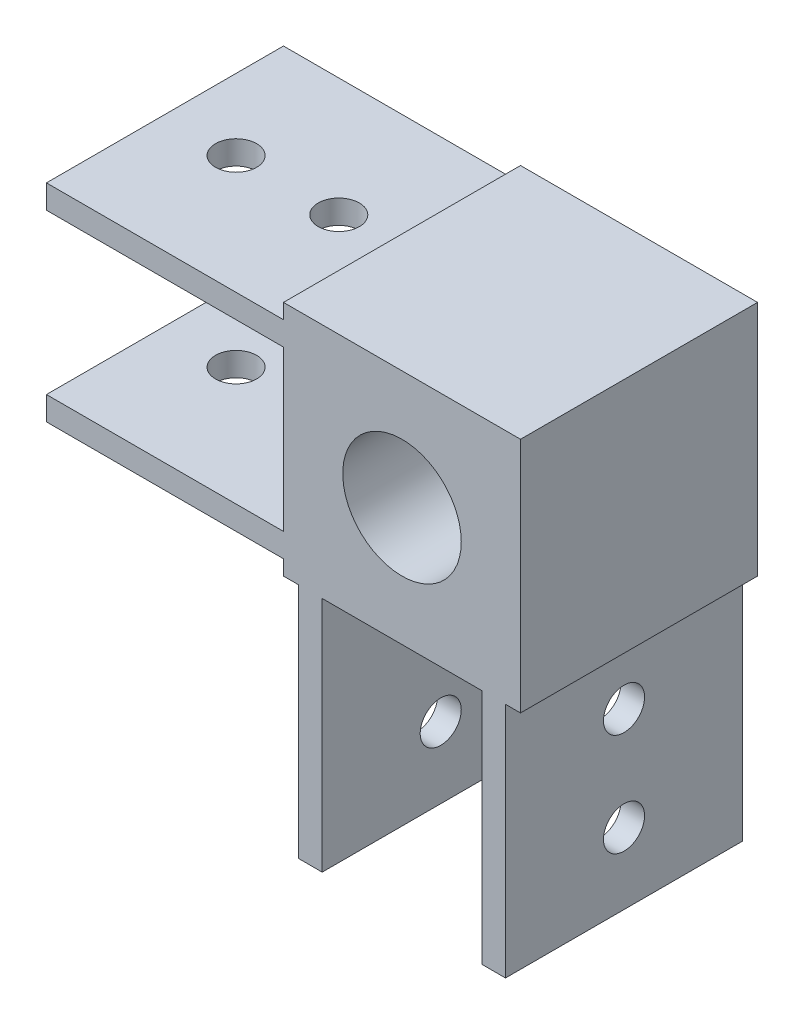
ISO-10303-21;
HEADER;
FILE_DESCRIPTION(('STEP AP214'),'2;1');
FILE_NAME('part.step','',(''),(''),'','','');
FILE_SCHEMA(('AUTOMOTIVE_DESIGN { 1 0 10303 214 1 1 1 1 }'));
ENDSEC;
DATA;
#1=APPLICATION_CONTEXT('core data for automotive mechanical design processes');
#2=APPLICATION_PROTOCOL_DEFINITION('international standard','automotive_design',2000,#1);
#3=PRODUCT_CONTEXT('',#1,'mechanical');
#4=PRODUCT('Part','Part','',(#3));
#5=PRODUCT_RELATED_PRODUCT_CATEGORY('part','',(#4));
#6=PRODUCT_DEFINITION_FORMATION('','',#4);
#7=PRODUCT_DEFINITION_CONTEXT('part definition',#1,'design');
#8=PRODUCT_DEFINITION('design','',#6,#7);
#9=PRODUCT_DEFINITION_SHAPE('','',#8);
#10=(LENGTH_UNIT() NAMED_UNIT(*) SI_UNIT(.MILLI.,.METRE.));
#11=(NAMED_UNIT(*) PLANE_ANGLE_UNIT() SI_UNIT($,.RADIAN.));
#12=(NAMED_UNIT(*) SI_UNIT($,.STERADIAN.) SOLID_ANGLE_UNIT());
#13=UNCERTAINTY_MEASURE_WITH_UNIT(LENGTH_MEASURE(1.E-05),#10,'distance_accuracy_value','');
#14=(GEOMETRIC_REPRESENTATION_CONTEXT(3) GLOBAL_UNCERTAINTY_ASSIGNED_CONTEXT((#13)) GLOBAL_UNIT_ASSIGNED_CONTEXT((#10,
#11,#12)) REPRESENTATION_CONTEXT('',''));
#15=CARTESIAN_POINT('',(0.,0.,0.));
#16=DIRECTION('',(0.,0.,1.));
#17=DIRECTION('',(1.,0.,0.));
#18=AXIS2_PLACEMENT_3D('',#15,#16,#17);
#19=CARTESIAN_POINT('',(15.,-15.,30.));
#20=DIRECTION('',(-1.,0.,0.));
#21=DIRECTION('',(0.,-1.,0.));
#22=AXIS2_PLACEMENT_3D('',#19,#20,#21);
#23=PLANE('',#22);
#24=DIRECTION('',(0.,1.,0.));
#25=VECTOR('',#24,1.);
#26=CARTESIAN_POINT('',(15.,-15.,0.));
#27=LINE('',#26,#25);
#28=CARTESIAN_POINT('',(15.,-15.,0.));
#29=VERTEX_POINT('',#28);
#30=CARTESIAN_POINT('',(15.,15.,0.));
#31=VERTEX_POINT('',#30);
#32=EDGE_CURVE('E209',#29,#31,#27,.T.);
#33=ORIENTED_EDGE('',*,*,#32,.T.);
#34=DIRECTION('',(0.,0.,-1.));
#35=VECTOR('',#34,1.);
#36=CARTESIAN_POINT('',(15.,15.,30.));
#37=LINE('',#36,#35);
#38=CARTESIAN_POINT('',(15.,15.,30.));
#39=VERTEX_POINT('',#38);
#40=EDGE_CURVE('E11',#39,#31,#37,.T.);
#41=ORIENTED_EDGE('',*,*,#40,.F.);
#42=DIRECTION('',(0.,1.,0.));
#43=VECTOR('',#42,1.);
#44=CARTESIAN_POINT('',(15.,-15.,30.));
#45=LINE('',#44,#43);
#46=CARTESIAN_POINT('',(15.,-15.,30.));
#47=VERTEX_POINT('',#46);
#48=EDGE_CURVE('E248',#47,#39,#45,.T.);
#49=ORIENTED_EDGE('',*,*,#48,.F.);
#50=DIRECTION('',(0.,0.,-1.));
#51=VECTOR('',#50,1.);
#52=CARTESIAN_POINT('',(15.,-15.,30.));
#53=LINE('',#52,#51);
#54=EDGE_CURVE('E205',#47,#29,#53,.T.);
#55=ORIENTED_EDGE('',*,*,#54,.T.);
#56=EDGE_LOOP('',(#33,#41,#49,#55));
#57=FACE_BOUND('',#56,.T.);
#58=ADVANCED_FACE('F39',(#57),#23,.F.);
#59=CARTESIAN_POINT('',(-15.,15.,30.));
#60=DIRECTION('',(0.,-1.,0.));
#61=DIRECTION('',(1.,0.,0.));
#62=AXIS2_PLACEMENT_3D('',#59,#60,#61);
#63=PLANE('',#62);
#64=DIRECTION('',(-1.,0.,0.));
#65=VECTOR('',#64,1.);
#66=CARTESIAN_POINT('',(-15.,15.,0.));
#67=LINE('',#66,#65);
#68=CARTESIAN_POINT('',(-15.,15.,0.));
#69=VERTEX_POINT('',#68);
#70=EDGE_CURVE('E212',#31,#69,#67,.T.);
#71=ORIENTED_EDGE('',*,*,#70,.T.);
#72=DIRECTION('',(0.,0.,-1.));
#73=VECTOR('',#72,1.);
#74=CARTESIAN_POINT('',(-15.,15.,30.));
#75=LINE('',#74,#73);
#76=CARTESIAN_POINT('',(-15.,15.,30.));
#77=VERTEX_POINT('',#76);
#78=EDGE_CURVE('E48',#77,#69,#75,.T.);
#79=ORIENTED_EDGE('',*,*,#78,.F.);
#80=DIRECTION('',(-1.,0.,0.));
#81=VECTOR('',#80,1.);
#82=CARTESIAN_POINT('',(-15.,15.,30.));
#83=LINE('',#82,#81);
#84=EDGE_CURVE('E136',#39,#77,#83,.T.);
#85=ORIENTED_EDGE('',*,*,#84,.F.);
#86=ORIENTED_EDGE('',*,*,#40,.T.);
#87=EDGE_LOOP('',(#71,#79,#85,#86));
#88=FACE_BOUND('',#87,.T.);
#89=ADVANCED_FACE('F408',(#88),#63,.F.);
#90=CARTESIAN_POINT('',(-15.,13.1,30.));
#91=DIRECTION('',(1.,0.,0.));
#92=DIRECTION('',(0.,1.,0.));
#93=AXIS2_PLACEMENT_3D('',#90,#91,#92);
#94=PLANE('',#93);
#95=DIRECTION('',(0.,-1.,0.));
#96=VECTOR('',#95,1.);
#97=CARTESIAN_POINT('',(-15.,13.1,0.));
#98=LINE('',#97,#96);
#99=CARTESIAN_POINT('',(-15.,13.1,0.));
#100=VERTEX_POINT('',#99);
#101=EDGE_CURVE('E215',#69,#100,#98,.T.);
#102=ORIENTED_EDGE('',*,*,#101,.T.);
#103=DIRECTION('',(0.,0.,-1.));
#104=VECTOR('',#103,1.);
#105=CARTESIAN_POINT('',(-15.,13.1,30.));
#106=LINE('',#105,#104);
#107=CARTESIAN_POINT('',(-15.,13.1,30.));
#108=VERTEX_POINT('',#107);
#109=EDGE_CURVE('E291',#108,#100,#106,.T.);
#110=ORIENTED_EDGE('',*,*,#109,.F.);
#111=DIRECTION('',(0.,-1.,0.));
#112=VECTOR('',#111,1.);
#113=CARTESIAN_POINT('',(-15.,13.1,30.));
#114=LINE('',#113,#112);
#115=EDGE_CURVE('E351',#77,#108,#114,.T.);
#116=ORIENTED_EDGE('',*,*,#115,.F.);
#117=ORIENTED_EDGE('',*,*,#78,.T.);
#118=EDGE_LOOP('',(#102,#110,#116,#117));
#119=FACE_BOUND('',#118,.T.);
#120=ADVANCED_FACE('F412',(#119),#94,.F.);
#121=CARTESIAN_POINT('',(-15.,13.1,30.));
#122=DIRECTION('',(0.,-1.,0.));
#123=DIRECTION('',(1.,0.,0.));
#124=AXIS2_PLACEMENT_3D('',#121,#122,#123);
#125=PLANE('',#124);
#126=CARTESIAN_POINT('',(-23.,13.1,15.));
#127=DIRECTION('',(0.,1.,0.));
#128=DIRECTION('',(-1.,0.,0.));
#129=AXIS2_PLACEMENT_3D('',#126,#127,#128);
#130=CIRCLE('',#129,2.6);
#131=CARTESIAN_POINT('',(-25.6,13.1,15.));
#132=VERTEX_POINT('',#131);
#133=EDGE_CURVE('E298',#132,#132,#130,.T.);
#134=ORIENTED_EDGE('',*,*,#133,.F.);
#135=EDGE_LOOP('',(#134));
#136=FACE_BOUND('',#135,.T.);
#137=CARTESIAN_POINT('',(-36.,13.1,15.));
#138=DIRECTION('',(0.,1.,0.));
#139=DIRECTION('',(-1.,0.,0.));
#140=AXIS2_PLACEMENT_3D('',#137,#138,#139);
#141=CIRCLE('',#140,2.6);
#142=CARTESIAN_POINT('',(-38.6,13.1,15.));
#143=VERTEX_POINT('',#142);
#144=EDGE_CURVE('E305',#143,#143,#141,.T.);
#145=ORIENTED_EDGE('',*,*,#144,.F.);
#146=EDGE_LOOP('',(#145));
#147=FACE_BOUND('',#146,.T.);
#148=DIRECTION('',(-1.,0.,0.));
#149=VECTOR('',#148,1.);
#150=CARTESIAN_POINT('',(-15.,13.1,0.));
#151=LINE('',#150,#149);
#152=CARTESIAN_POINT('',(-45.,13.1,0.));
#153=VERTEX_POINT('',#152);
#154=EDGE_CURVE('E217',#100,#153,#151,.T.);
#155=ORIENTED_EDGE('',*,*,#154,.T.);
#156=DIRECTION('',(0.,0.,-1.));
#157=VECTOR('',#156,1.);
#158=CARTESIAN_POINT('',(-45.,13.1,30.));
#159=LINE('',#158,#157);
#160=CARTESIAN_POINT('',(-45.,13.1,30.));
#161=VERTEX_POINT('',#160);
#162=EDGE_CURVE('E288',#161,#153,#159,.T.);
#163=ORIENTED_EDGE('',*,*,#162,.F.);
#164=DIRECTION('',(-1.,0.,0.));
#165=VECTOR('',#164,1.);
#166=CARTESIAN_POINT('',(-15.,13.1,30.));
#167=LINE('',#166,#165);
#168=EDGE_CURVE('E353',#108,#161,#167,.T.);
#169=ORIENTED_EDGE('',*,*,#168,.F.);
#170=ORIENTED_EDGE('',*,*,#109,.T.);
#171=EDGE_LOOP('',(#155,#163,#169,#170));
#172=FACE_BOUND('',#171,.T.);
#173=ADVANCED_FACE('F416',(#136,#147,#172),#125,.F.);
#174=CARTESIAN_POINT('',(-45.,13.1,30.));
#175=DIRECTION('',(1.,0.,0.));
#176=DIRECTION('',(0.,0.,-1.));
#177=AXIS2_PLACEMENT_3D('',#174,#175,#176);
#178=PLANE('',#177);
#179=DIRECTION('',(0.,-1.,0.));
#180=VECTOR('',#179,1.);
#181=CARTESIAN_POINT('',(-45.,13.1,0.));
#182=LINE('',#181,#180);
#183=CARTESIAN_POINT('',(-45.,10.1,0.));
#184=VERTEX_POINT('',#183);
#185=EDGE_CURVE('E219',#153,#184,#182,.T.);
#186=ORIENTED_EDGE('',*,*,#185,.T.);
#187=DIRECTION('',(0.,0.,-1.));
#188=VECTOR('',#187,1.);
#189=CARTESIAN_POINT('',(-45.,10.1,30.));
#190=LINE('',#189,#188);
#191=CARTESIAN_POINT('',(-45.,10.1,30.));
#192=VERTEX_POINT('',#191);
#193=EDGE_CURVE('E285',#192,#184,#190,.T.);
#194=ORIENTED_EDGE('',*,*,#193,.F.);
#195=DIRECTION('',(0.,-1.,0.));
#196=VECTOR('',#195,1.);
#197=CARTESIAN_POINT('',(-45.,13.1,30.));
#198=LINE('',#197,#196);
#199=EDGE_CURVE('E355',#161,#192,#198,.T.);
#200=ORIENTED_EDGE('',*,*,#199,.F.);
#201=ORIENTED_EDGE('',*,*,#162,.T.);
#202=EDGE_LOOP('',(#186,#194,#200,#201));
#203=FACE_BOUND('',#202,.T.);
#204=ADVANCED_FACE('F422',(#203),#178,.F.);
#205=CARTESIAN_POINT('',(-15.,10.1,30.));
#206=DIRECTION('',(0.,1.,0.));
#207=DIRECTION('',(-1.,0.,0.));
#208=AXIS2_PLACEMENT_3D('',#205,#206,#207);
#209=PLANE('',#208);
#210=CARTESIAN_POINT('',(-23.,10.1,15.));
#211=DIRECTION('',(0.,1.,0.));
#212=DIRECTION('',(-1.,0.,0.));
#213=AXIS2_PLACEMENT_3D('',#210,#211,#212);
#214=CIRCLE('',#213,2.6);
#215=CARTESIAN_POINT('',(-25.6,10.1,15.));
#216=VERTEX_POINT('',#215);
#217=EDGE_CURVE('E317',#216,#216,#214,.T.);
#218=ORIENTED_EDGE('',*,*,#217,.T.);
#219=EDGE_LOOP('',(#218));
#220=FACE_BOUND('',#219,.T.);
#221=CARTESIAN_POINT('',(-36.,10.1,15.));
#222=DIRECTION('',(0.,1.,0.));
#223=DIRECTION('',(-1.,0.,0.));
#224=AXIS2_PLACEMENT_3D('',#221,#222,#223);
#225=CIRCLE('',#224,2.6);
#226=CARTESIAN_POINT('',(-38.6,10.1,15.));
#227=VERTEX_POINT('',#226);
#228=EDGE_CURVE('E302',#227,#227,#225,.T.);
#229=ORIENTED_EDGE('',*,*,#228,.T.);
#230=EDGE_LOOP('',(#229));
#231=FACE_BOUND('',#230,.T.);
#232=DIRECTION('',(1.,0.,0.));
#233=VECTOR('',#232,1.);
#234=CARTESIAN_POINT('',(-15.,10.1,0.));
#235=LINE('',#234,#233);
#236=CARTESIAN_POINT('',(-15.,10.1,0.));
#237=VERTEX_POINT('',#236);
#238=EDGE_CURVE('E221',#184,#237,#235,.T.);
#239=ORIENTED_EDGE('',*,*,#238,.T.);
#240=DIRECTION('',(0.,0.,-1.));
#241=VECTOR('',#240,1.);
#242=CARTESIAN_POINT('',(-15.,10.1,30.));
#243=LINE('',#242,#241);
#244=CARTESIAN_POINT('',(-15.,10.1,30.));
#245=VERTEX_POINT('',#244);
#246=EDGE_CURVE('E282',#245,#237,#243,.T.);
#247=ORIENTED_EDGE('',*,*,#246,.F.);
#248=DIRECTION('',(1.,0.,0.));
#249=VECTOR('',#248,1.);
#250=CARTESIAN_POINT('',(-15.,10.1,30.));
#251=LINE('',#250,#249);
#252=EDGE_CURVE('E357',#192,#245,#251,.T.);
#253=ORIENTED_EDGE('',*,*,#252,.F.);
#254=ORIENTED_EDGE('',*,*,#193,.T.);
#255=EDGE_LOOP('',(#239,#247,#253,#254));
#256=FACE_BOUND('',#255,.T.);
#257=ADVANCED_FACE('F426',(#220,#231,#256),#209,.F.);
#258=CARTESIAN_POINT('',(-15.,-10.1,30.));
#259=DIRECTION('',(1.,0.,0.));
#260=DIRECTION('',(0.,1.,0.));
#261=AXIS2_PLACEMENT_3D('',#258,#259,#260);
#262=PLANE('',#261);
#263=DIRECTION('',(0.,-1.,0.));
#264=VECTOR('',#263,1.);
#265=CARTESIAN_POINT('',(-15.,-10.1,0.));
#266=LINE('',#265,#264);
#267=CARTESIAN_POINT('',(-15.,-10.1,0.));
#268=VERTEX_POINT('',#267);
#269=EDGE_CURVE('E223',#237,#268,#266,.T.);
#270=ORIENTED_EDGE('',*,*,#269,.T.);
#271=DIRECTION('',(0.,0.,-1.));
#272=VECTOR('',#271,1.);
#273=CARTESIAN_POINT('',(-15.,-10.1,30.));
#274=LINE('',#273,#272);
#275=CARTESIAN_POINT('',(-15.,-10.1,30.));
#276=VERTEX_POINT('',#275);
#277=EDGE_CURVE('E279',#276,#268,#274,.T.);
#278=ORIENTED_EDGE('',*,*,#277,.F.);
#279=DIRECTION('',(0.,-1.,0.));
#280=VECTOR('',#279,1.);
#281=CARTESIAN_POINT('',(-15.,-10.1,30.));
#282=LINE('',#281,#280);
#283=EDGE_CURVE('E359',#245,#276,#282,.T.);
#284=ORIENTED_EDGE('',*,*,#283,.F.);
#285=ORIENTED_EDGE('',*,*,#246,.T.);
#286=EDGE_LOOP('',(#270,#278,#284,#285));
#287=FACE_BOUND('',#286,.T.);
#288=ADVANCED_FACE('F430',(#287),#262,.F.);
#289=CARTESIAN_POINT('',(-15.,-10.1,30.));
#290=DIRECTION('',(0.,-1.,0.));
#291=DIRECTION('',(1.,0.,0.));
#292=AXIS2_PLACEMENT_3D('',#289,#290,#291);
#293=PLANE('',#292);
#294=CARTESIAN_POINT('',(-23.,-10.1,15.));
#295=DIRECTION('',(0.,-1.,0.));
#296=DIRECTION('',(1.,0.,0.));
#297=AXIS2_PLACEMENT_3D('',#294,#295,#296);
#298=CIRCLE('',#297,2.6);
#299=CARTESIAN_POINT('',(-20.4,-10.1,15.));
#300=VERTEX_POINT('',#299);
#301=EDGE_CURVE('E314',#300,#300,#298,.T.);
#302=ORIENTED_EDGE('',*,*,#301,.T.);
#303=EDGE_LOOP('',(#302));
#304=FACE_BOUND('',#303,.T.);
#305=CARTESIAN_POINT('',(-36.,-10.1,15.));
#306=DIRECTION('',(0.,-1.,0.));
#307=DIRECTION('',(1.,0.,0.));
#308=AXIS2_PLACEMENT_3D('',#305,#306,#307);
#309=CIRCLE('',#308,2.6);
#310=CARTESIAN_POINT('',(-33.4,-10.1,15.));
#311=VERTEX_POINT('',#310);
#312=EDGE_CURVE('E297',#311,#311,#309,.T.);
#313=ORIENTED_EDGE('',*,*,#312,.T.);
#314=EDGE_LOOP('',(#313));
#315=FACE_BOUND('',#314,.T.);
#316=DIRECTION('',(-1.,0.,0.));
#317=VECTOR('',#316,1.);
#318=CARTESIAN_POINT('',(-15.,-10.1,0.));
#319=LINE('',#318,#317);
#320=CARTESIAN_POINT('',(-45.,-10.1,0.));
#321=VERTEX_POINT('',#320);
#322=EDGE_CURVE('E225',#268,#321,#319,.T.);
#323=ORIENTED_EDGE('',*,*,#322,.T.);
#324=DIRECTION('',(0.,0.,-1.));
#325=VECTOR('',#324,1.);
#326=CARTESIAN_POINT('',(-45.,-10.1,30.));
#327=LINE('',#326,#325);
#328=CARTESIAN_POINT('',(-45.,-10.1,30.));
#329=VERTEX_POINT('',#328);
#330=EDGE_CURVE('E276',#329,#321,#327,.T.);
#331=ORIENTED_EDGE('',*,*,#330,.F.);
#332=DIRECTION('',(-1.,0.,0.));
#333=VECTOR('',#332,1.);
#334=CARTESIAN_POINT('',(-15.,-10.1,30.));
#335=LINE('',#334,#333);
#336=EDGE_CURVE('E361',#276,#329,#335,.T.);
#337=ORIENTED_EDGE('',*,*,#336,.F.);
#338=ORIENTED_EDGE('',*,*,#277,.T.);
#339=EDGE_LOOP('',(#323,#331,#337,#338));
#340=FACE_BOUND('',#339,.T.);
#341=ADVANCED_FACE('F434',(#304,#315,#340),#293,.F.);
#342=CARTESIAN_POINT('',(-45.,-13.1,30.));
#343=DIRECTION('',(1.,0.,0.));
#344=DIRECTION('',(0.,0.,-1.));
#345=AXIS2_PLACEMENT_3D('',#342,#343,#344);
#346=PLANE('',#345);
#347=DIRECTION('',(0.,-1.,0.));
#348=VECTOR('',#347,1.);
#349=CARTESIAN_POINT('',(-45.,-13.1,0.));
#350=LINE('',#349,#348);
#351=CARTESIAN_POINT('',(-45.,-13.1,0.));
#352=VERTEX_POINT('',#351);
#353=EDGE_CURVE('E227',#321,#352,#350,.T.);
#354=ORIENTED_EDGE('',*,*,#353,.T.);
#355=DIRECTION('',(0.,0.,-1.));
#356=VECTOR('',#355,1.);
#357=CARTESIAN_POINT('',(-45.,-13.1,30.));
#358=LINE('',#357,#356);
#359=CARTESIAN_POINT('',(-45.,-13.1,30.));
#360=VERTEX_POINT('',#359);
#361=EDGE_CURVE('E273',#360,#352,#358,.T.);
#362=ORIENTED_EDGE('',*,*,#361,.F.);
#363=DIRECTION('',(0.,-1.,0.));
#364=VECTOR('',#363,1.);
#365=CARTESIAN_POINT('',(-45.,-13.1,30.));
#366=LINE('',#365,#364);
#367=EDGE_CURVE('E363',#329,#360,#366,.T.);
#368=ORIENTED_EDGE('',*,*,#367,.F.);
#369=ORIENTED_EDGE('',*,*,#330,.T.);
#370=EDGE_LOOP('',(#354,#362,#368,#369));
#371=FACE_BOUND('',#370,.T.);
#372=ADVANCED_FACE('F438',(#371),#346,.F.);
#373=CARTESIAN_POINT('',(-15.,-13.1,30.));
#374=DIRECTION('',(0.,1.,0.));
#375=DIRECTION('',(-1.,0.,0.));
#376=AXIS2_PLACEMENT_3D('',#373,#374,#375);
#377=PLANE('',#376);
#378=CARTESIAN_POINT('',(-23.,-13.1,15.));
#379=DIRECTION('',(0.,1.,0.));
#380=DIRECTION('',(-1.,0.,0.));
#381=AXIS2_PLACEMENT_3D('',#378,#379,#380);
#382=CIRCLE('',#381,2.6);
#383=CARTESIAN_POINT('',(-25.6,-13.1,15.));
#384=VERTEX_POINT('',#383);
#385=EDGE_CURVE('E42',#384,#384,#382,.T.);
#386=ORIENTED_EDGE('',*,*,#385,.T.);
#387=EDGE_LOOP('',(#386));
#388=FACE_BOUND('',#387,.T.);
#389=CARTESIAN_POINT('',(-36.,-13.1,15.));
#390=DIRECTION('',(0.,1.,0.));
#391=DIRECTION('',(-1.,0.,0.));
#392=AXIS2_PLACEMENT_3D('',#389,#390,#391);
#393=CIRCLE('',#392,2.6);
#394=CARTESIAN_POINT('',(-38.6,-13.1,15.));
#395=VERTEX_POINT('',#394);
#396=EDGE_CURVE('E295',#395,#395,#393,.T.);
#397=ORIENTED_EDGE('',*,*,#396,.T.);
#398=EDGE_LOOP('',(#397));
#399=FACE_BOUND('',#398,.T.);
#400=DIRECTION('',(1.,0.,0.));
#401=VECTOR('',#400,1.);
#402=CARTESIAN_POINT('',(-15.,-13.1,0.));
#403=LINE('',#402,#401);
#404=CARTESIAN_POINT('',(-15.,-13.1,0.));
#405=VERTEX_POINT('',#404);
#406=EDGE_CURVE('E229',#352,#405,#403,.T.);
#407=ORIENTED_EDGE('',*,*,#406,.T.);
#408=DIRECTION('',(0.,0.,-1.));
#409=VECTOR('',#408,1.);
#410=CARTESIAN_POINT('',(-15.,-13.1,30.));
#411=LINE('',#410,#409);
#412=CARTESIAN_POINT('',(-15.,-13.1,30.));
#413=VERTEX_POINT('',#412);
#414=EDGE_CURVE('E270',#413,#405,#411,.T.);
#415=ORIENTED_EDGE('',*,*,#414,.F.);
#416=DIRECTION('',(1.,0.,0.));
#417=VECTOR('',#416,1.);
#418=CARTESIAN_POINT('',(-15.,-13.1,30.));
#419=LINE('',#418,#417);
#420=EDGE_CURVE('E365',#360,#413,#419,.T.);
#421=ORIENTED_EDGE('',*,*,#420,.F.);
#422=ORIENTED_EDGE('',*,*,#361,.T.);
#423=EDGE_LOOP('',(#407,#415,#421,#422));
#424=FACE_BOUND('',#423,.T.);
#425=ADVANCED_FACE('F442',(#388,#399,#424),#377,.F.);
#426=CARTESIAN_POINT('',(-15.,-15.,30.));
#427=DIRECTION('',(1.,0.,0.));
#428=DIRECTION('',(0.,1.,0.));
#429=AXIS2_PLACEMENT_3D('',#426,#427,#428);
#430=PLANE('',#429);
#431=DIRECTION('',(0.,-1.,0.));
#432=VECTOR('',#431,1.);
#433=CARTESIAN_POINT('',(-15.,-15.,0.));
#434=LINE('',#433,#432);
#435=CARTESIAN_POINT('',(-15.,-15.,0.));
#436=VERTEX_POINT('',#435);
#437=EDGE_CURVE('E231',#405,#436,#434,.T.);
#438=ORIENTED_EDGE('',*,*,#437,.T.);
#439=DIRECTION('',(0.,0.,-1.));
#440=VECTOR('',#439,1.);
#441=CARTESIAN_POINT('',(-15.,-15.,30.));
#442=LINE('',#441,#440);
#443=CARTESIAN_POINT('',(-15.,-15.,30.));
#444=VERTEX_POINT('',#443);
#445=EDGE_CURVE('E267',#444,#436,#442,.T.);
#446=ORIENTED_EDGE('',*,*,#445,.F.);
#447=DIRECTION('',(0.,-1.,0.));
#448=VECTOR('',#447,1.);
#449=CARTESIAN_POINT('',(-15.,-15.,30.));
#450=LINE('',#449,#448);
#451=EDGE_CURVE('E367',#413,#444,#450,.T.);
#452=ORIENTED_EDGE('',*,*,#451,.F.);
#453=ORIENTED_EDGE('',*,*,#414,.T.);
#454=EDGE_LOOP('',(#438,#446,#452,#453));
#455=FACE_BOUND('',#454,.T.);
#456=ADVANCED_FACE('F446',(#455),#430,.F.);
#457=CARTESIAN_POINT('',(-15.,-15.,30.));
#458=DIRECTION('',(0.,1.,0.));
#459=DIRECTION('',(0.,0.,1.));
#460=AXIS2_PLACEMENT_3D('',#457,#458,#459);
#461=PLANE('',#460);
#462=DIRECTION('',(1.,0.,0.));
#463=VECTOR('',#462,1.);
#464=CARTESIAN_POINT('',(-15.,-15.,0.));
#465=LINE('',#464,#463);
#466=CARTESIAN_POINT('',(-13.1,-15.,0.));
#467=VERTEX_POINT('',#466);
#468=EDGE_CURVE('E233',#436,#467,#465,.T.);
#469=ORIENTED_EDGE('',*,*,#468,.T.);
#470=DIRECTION('',(0.,0.,-1.));
#471=VECTOR('',#470,1.);
#472=CARTESIAN_POINT('',(-13.1,-15.,30.));
#473=LINE('',#472,#471);
#474=CARTESIAN_POINT('',(-13.1,-15.,30.));
#475=VERTEX_POINT('',#474);
#476=EDGE_CURVE('E264',#475,#467,#473,.T.);
#477=ORIENTED_EDGE('',*,*,#476,.F.);
#478=DIRECTION('',(1.,0.,0.));
#479=VECTOR('',#478,1.);
#480=CARTESIAN_POINT('',(-15.,-15.,30.));
#481=LINE('',#480,#479);
#482=EDGE_CURVE('E369',#444,#475,#481,.T.);
#483=ORIENTED_EDGE('',*,*,#482,.F.);
#484=ORIENTED_EDGE('',*,*,#445,.T.);
#485=EDGE_LOOP('',(#469,#477,#483,#484));
#486=FACE_BOUND('',#485,.T.);
#487=ADVANCED_FACE('F450',(#486),#461,.F.);
#488=CARTESIAN_POINT('',(-13.1,-15.,30.));
#489=DIRECTION('',(1.,0.,0.));
#490=DIRECTION('',(0.,1.,0.));
#491=AXIS2_PLACEMENT_3D('',#488,#489,#490);
#492=PLANE('',#491);
#493=CARTESIAN_POINT('',(-13.1,-23.,15.));
#494=DIRECTION('',(1.,0.,0.));
#495=DIRECTION('',(0.,1.,0.));
#496=AXIS2_PLACEMENT_3D('',#493,#494,#495);
#497=CIRCLE('',#496,2.6);
#498=CARTESIAN_POINT('',(-13.1,-20.4,15.));
#499=VERTEX_POINT('',#498);
#500=EDGE_CURVE('E341',#499,#499,#497,.T.);
#501=ORIENTED_EDGE('',*,*,#500,.T.);
#502=EDGE_LOOP('',(#501));
#503=FACE_BOUND('',#502,.T.);
#504=CARTESIAN_POINT('',(-13.1,-36.,15.));
#505=DIRECTION('',(1.,0.,0.));
#506=DIRECTION('',(0.,1.,0.));
#507=AXIS2_PLACEMENT_3D('',#504,#505,#506);
#508=CIRCLE('',#507,2.6);
#509=CARTESIAN_POINT('',(-13.1,-33.4,15.));
#510=VERTEX_POINT('',#509);
#511=EDGE_CURVE('E332',#510,#510,#508,.T.);
#512=ORIENTED_EDGE('',*,*,#511,.T.);
#513=EDGE_LOOP('',(#512));
#514=FACE_BOUND('',#513,.T.);
#515=DIRECTION('',(0.,-1.,0.));
#516=VECTOR('',#515,1.);
#517=CARTESIAN_POINT('',(-13.1,-15.,0.));
#518=LINE('',#517,#516);
#519=CARTESIAN_POINT('',(-13.1,-45.,0.));
#520=VERTEX_POINT('',#519);
#521=EDGE_CURVE('E235',#467,#520,#518,.T.);
#522=ORIENTED_EDGE('',*,*,#521,.T.);
#523=DIRECTION('',(0.,0.,-1.));
#524=VECTOR('',#523,1.);
#525=CARTESIAN_POINT('',(-13.1,-45.,30.));
#526=LINE('',#525,#524);
#527=CARTESIAN_POINT('',(-13.1,-45.,30.));
#528=VERTEX_POINT('',#527);
#529=EDGE_CURVE('E261',#528,#520,#526,.T.);
#530=ORIENTED_EDGE('',*,*,#529,.F.);
#531=DIRECTION('',(0.,-1.,0.));
#532=VECTOR('',#531,1.);
#533=CARTESIAN_POINT('',(-13.1,-15.,30.));
#534=LINE('',#533,#532);
#535=EDGE_CURVE('E371',#475,#528,#534,.T.);
#536=ORIENTED_EDGE('',*,*,#535,.F.);
#537=ORIENTED_EDGE('',*,*,#476,.T.);
#538=EDGE_LOOP('',(#522,#530,#536,#537));
#539=FACE_BOUND('',#538,.T.);
#540=ADVANCED_FACE('F454',(#503,#514,#539),#492,.F.);
#541=CARTESIAN_POINT('',(-13.1,-45.,30.));
#542=DIRECTION('',(0.,1.,0.));
#543=DIRECTION('',(0.,0.,1.));
#544=AXIS2_PLACEMENT_3D('',#541,#542,#543);
#545=PLANE('',#544);
#546=DIRECTION('',(1.,0.,0.));
#547=VECTOR('',#546,1.);
#548=CARTESIAN_POINT('',(-13.1,-45.,0.));
#549=LINE('',#548,#547);
#550=CARTESIAN_POINT('',(-10.1,-45.,0.));
#551=VERTEX_POINT('',#550);
#552=EDGE_CURVE('E237',#520,#551,#549,.T.);
#553=ORIENTED_EDGE('',*,*,#552,.T.);
#554=DIRECTION('',(0.,0.,-1.));
#555=VECTOR('',#554,1.);
#556=CARTESIAN_POINT('',(-10.1,-45.,30.));
#557=LINE('',#556,#555);
#558=CARTESIAN_POINT('',(-10.1,-45.,30.));
#559=VERTEX_POINT('',#558);
#560=EDGE_CURVE('E258',#559,#551,#557,.T.);
#561=ORIENTED_EDGE('',*,*,#560,.F.);
#562=DIRECTION('',(1.,0.,0.));
#563=VECTOR('',#562,1.);
#564=CARTESIAN_POINT('',(-13.1,-45.,30.));
#565=LINE('',#564,#563);
#566=EDGE_CURVE('E373',#528,#559,#565,.T.);
#567=ORIENTED_EDGE('',*,*,#566,.F.);
#568=ORIENTED_EDGE('',*,*,#529,.T.);
#569=EDGE_LOOP('',(#553,#561,#567,#568));
#570=FACE_BOUND('',#569,.T.);
#571=ADVANCED_FACE('F458',(#570),#545,.F.);
#572=CARTESIAN_POINT('',(-10.1,-15.,30.));
#573=DIRECTION('',(-1.,0.,0.));
#574=DIRECTION('',(0.,-1.,0.));
#575=AXIS2_PLACEMENT_3D('',#572,#573,#574);
#576=PLANE('',#575);
#577=CARTESIAN_POINT('',(-10.1,-23.,15.));
#578=DIRECTION('',(-1.,0.,0.));
#579=DIRECTION('',(0.,-1.,0.));
#580=AXIS2_PLACEMENT_3D('',#577,#578,#579);
#581=CIRCLE('',#580,2.6);
#582=CARTESIAN_POINT('',(-10.1,-25.6,15.));
#583=VERTEX_POINT('',#582);
#584=EDGE_CURVE('E338',#583,#583,#581,.T.);
#585=ORIENTED_EDGE('',*,*,#584,.T.);
#586=EDGE_LOOP('',(#585));
#587=FACE_BOUND('',#586,.T.);
#588=CARTESIAN_POINT('',(-10.1,-36.,15.));
#589=DIRECTION('',(-1.,0.,0.));
#590=DIRECTION('',(0.,-1.,0.));
#591=AXIS2_PLACEMENT_3D('',#588,#589,#590);
#592=CIRCLE('',#591,2.6);
#593=CARTESIAN_POINT('',(-10.1,-38.6,15.));
#594=VERTEX_POINT('',#593);
#595=EDGE_CURVE('E329',#594,#594,#592,.T.);
#596=ORIENTED_EDGE('',*,*,#595,.T.);
#597=EDGE_LOOP('',(#596));
#598=FACE_BOUND('',#597,.T.);
#599=DIRECTION('',(0.,1.,0.));
#600=VECTOR('',#599,1.);
#601=CARTESIAN_POINT('',(-10.1,-15.,0.));
#602=LINE('',#601,#600);
#603=CARTESIAN_POINT('',(-10.1,-15.,0.));
#604=VERTEX_POINT('',#603);
#605=EDGE_CURVE('E239',#551,#604,#602,.T.);
#606=ORIENTED_EDGE('',*,*,#605,.T.);
#607=DIRECTION('',(0.,0.,-1.));
#608=VECTOR('',#607,1.);
#609=CARTESIAN_POINT('',(-10.1,-15.,30.));
#610=LINE('',#609,#608);
#611=CARTESIAN_POINT('',(-10.1,-15.,30.));
#612=VERTEX_POINT('',#611);
#613=EDGE_CURVE('E255',#612,#604,#610,.T.);
#614=ORIENTED_EDGE('',*,*,#613,.F.);
#615=DIRECTION('',(0.,1.,0.));
#616=VECTOR('',#615,1.);
#617=CARTESIAN_POINT('',(-10.1,-15.,30.));
#618=LINE('',#617,#616);
#619=EDGE_CURVE('E375',#559,#612,#618,.T.);
#620=ORIENTED_EDGE('',*,*,#619,.F.);
#621=ORIENTED_EDGE('',*,*,#560,.T.);
#622=EDGE_LOOP('',(#606,#614,#620,#621));
#623=FACE_BOUND('',#622,.T.);
#624=ADVANCED_FACE('F462',(#587,#598,#623),#576,.F.);
#625=CARTESIAN_POINT('',(-10.1,-15.,30.));
#626=DIRECTION('',(0.,1.,0.));
#627=DIRECTION('',(-1.,0.,0.));
#628=AXIS2_PLACEMENT_3D('',#625,#626,#627);
#629=PLANE('',#628);
#630=DIRECTION('',(1.,0.,0.));
#631=VECTOR('',#630,1.);
#632=CARTESIAN_POINT('',(-10.1,-15.,0.));
#633=LINE('',#632,#631);
#634=CARTESIAN_POINT('',(10.1,-15.,0.));
#635=VERTEX_POINT('',#634);
#636=EDGE_CURVE('E241',#604,#635,#633,.T.);
#637=ORIENTED_EDGE('',*,*,#636,.T.);
#638=DIRECTION('',(0.,0.,-1.));
#639=VECTOR('',#638,1.);
#640=CARTESIAN_POINT('',(10.1,-15.,30.));
#641=LINE('',#640,#639);
#642=CARTESIAN_POINT('',(10.1,-15.,30.));
#643=VERTEX_POINT('',#642);
#644=EDGE_CURVE('E252',#643,#635,#641,.T.);
#645=ORIENTED_EDGE('',*,*,#644,.F.);
#646=DIRECTION('',(1.,0.,0.));
#647=VECTOR('',#646,1.);
#648=CARTESIAN_POINT('',(-10.1,-15.,30.));
#649=LINE('',#648,#647);
#650=EDGE_CURVE('E377',#612,#643,#649,.T.);
#651=ORIENTED_EDGE('',*,*,#650,.F.);
#652=ORIENTED_EDGE('',*,*,#613,.T.);
#653=EDGE_LOOP('',(#637,#645,#651,#652));
#654=FACE_BOUND('',#653,.T.);
#655=ADVANCED_FACE('F383',(#654),#629,.F.);
#656=CARTESIAN_POINT('',(10.1,-15.,30.));
#657=DIRECTION('',(1.,0.,0.));
#658=DIRECTION('',(0.,1.,0.));
#659=AXIS2_PLACEMENT_3D('',#656,#657,#658);
#660=PLANE('',#659);
#661=CARTESIAN_POINT('',(10.1,-23.,15.));
#662=DIRECTION('',(1.,0.,0.));
#663=DIRECTION('',(0.,1.,0.));
#664=AXIS2_PLACEMENT_3D('',#661,#662,#663);
#665=CIRCLE('',#664,2.6);
#666=CARTESIAN_POINT('',(10.1,-20.4,15.));
#667=VERTEX_POINT('',#666);
#668=EDGE_CURVE('E335',#667,#667,#665,.T.);
#669=ORIENTED_EDGE('',*,*,#668,.T.);
#670=EDGE_LOOP('',(#669));
#671=FACE_BOUND('',#670,.T.);
#672=CARTESIAN_POINT('',(10.1,-36.,15.));
#673=DIRECTION('',(1.,0.,0.));
#674=DIRECTION('',(0.,1.,0.));
#675=AXIS2_PLACEMENT_3D('',#672,#673,#674);
#676=CIRCLE('',#675,2.6);
#677=CARTESIAN_POINT('',(10.1,-33.4,15.));
#678=VERTEX_POINT('',#677);
#679=EDGE_CURVE('E324',#678,#678,#676,.T.);
#680=ORIENTED_EDGE('',*,*,#679,.T.);
#681=EDGE_LOOP('',(#680));
#682=FACE_BOUND('',#681,.T.);
#683=DIRECTION('',(0.,-1.,0.));
#684=VECTOR('',#683,1.);
#685=CARTESIAN_POINT('',(10.1,-15.,0.));
#686=LINE('',#685,#684);
#687=CARTESIAN_POINT('',(10.1,-45.,0.));
#688=VERTEX_POINT('',#687);
#689=EDGE_CURVE('E243',#635,#688,#686,.T.);
#690=ORIENTED_EDGE('',*,*,#689,.T.);
#691=DIRECTION('',(0.,0.,-1.));
#692=VECTOR('',#691,1.);
#693=CARTESIAN_POINT('',(10.1,-45.,30.));
#694=LINE('',#693,#692);
#695=CARTESIAN_POINT('',(10.1,-45.,30.));
#696=VERTEX_POINT('',#695);
#697=EDGE_CURVE('E200',#696,#688,#694,.T.);
#698=ORIENTED_EDGE('',*,*,#697,.F.);
#699=DIRECTION('',(0.,-1.,0.));
#700=VECTOR('',#699,1.);
#701=CARTESIAN_POINT('',(10.1,-15.,30.));
#702=LINE('',#701,#700);
#703=EDGE_CURVE('E191',#643,#696,#702,.T.);
#704=ORIENTED_EDGE('',*,*,#703,.F.);
#705=ORIENTED_EDGE('',*,*,#644,.T.);
#706=EDGE_LOOP('',(#690,#698,#704,#705));
#707=FACE_BOUND('',#706,.T.);
#708=ADVANCED_FACE('F387',(#671,#682,#707),#660,.F.);
#709=CARTESIAN_POINT('',(10.1,-45.,30.));
#710=DIRECTION('',(0.,1.,0.));
#711=DIRECTION('',(0.,0.,1.));
#712=AXIS2_PLACEMENT_3D('',#709,#710,#711);
#713=PLANE('',#712);
#714=DIRECTION('',(1.,0.,0.));
#715=VECTOR('',#714,1.);
#716=CARTESIAN_POINT('',(10.1,-45.,0.));
#717=LINE('',#716,#715);
#718=CARTESIAN_POINT('',(13.1,-45.,0.));
#719=VERTEX_POINT('',#718);
#720=EDGE_CURVE('E199',#688,#719,#717,.T.);
#721=ORIENTED_EDGE('',*,*,#720,.T.);
#722=DIRECTION('',(0.,0.,-1.));
#723=VECTOR('',#722,1.);
#724=CARTESIAN_POINT('',(13.1,-45.,30.));
#725=LINE('',#724,#723);
#726=CARTESIAN_POINT('',(13.1,-45.,30.));
#727=VERTEX_POINT('',#726);
#728=EDGE_CURVE('E196',#727,#719,#725,.T.);
#729=ORIENTED_EDGE('',*,*,#728,.F.);
#730=DIRECTION('',(1.,0.,0.));
#731=VECTOR('',#730,1.);
#732=CARTESIAN_POINT('',(10.1,-45.,30.));
#733=LINE('',#732,#731);
#734=EDGE_CURVE('E185',#696,#727,#733,.T.);
#735=ORIENTED_EDGE('',*,*,#734,.F.);
#736=ORIENTED_EDGE('',*,*,#697,.T.);
#737=EDGE_LOOP('',(#721,#729,#735,#736));
#738=FACE_BOUND('',#737,.T.);
#739=ADVANCED_FACE('F197',(#738),#713,.F.);
#740=CARTESIAN_POINT('',(13.1,-15.,30.));
#741=DIRECTION('',(-1.,0.,0.));
#742=DIRECTION('',(0.,-1.,0.));
#743=AXIS2_PLACEMENT_3D('',#740,#741,#742);
#744=PLANE('',#743);
#745=CARTESIAN_POINT('',(13.1,-23.,15.));
#746=DIRECTION('',(1.,0.,0.));
#747=DIRECTION('',(0.,1.,0.));
#748=AXIS2_PLACEMENT_3D('',#745,#746,#747);
#749=CIRCLE('',#748,2.6);
#750=CARTESIAN_POINT('',(13.1,-20.4,15.));
#751=VERTEX_POINT('',#750);
#752=EDGE_CURVE('E321',#751,#751,#749,.T.);
#753=ORIENTED_EDGE('',*,*,#752,.F.);
#754=EDGE_LOOP('',(#753));
#755=FACE_BOUND('',#754,.T.);
#756=CARTESIAN_POINT('',(13.1,-36.,15.));
#757=DIRECTION('',(1.,0.,0.));
#758=DIRECTION('',(0.,1.,0.));
#759=AXIS2_PLACEMENT_3D('',#756,#757,#758);
#760=CIRCLE('',#759,2.6);
#761=CARTESIAN_POINT('',(13.1,-33.4,15.));
#762=VERTEX_POINT('',#761);
#763=EDGE_CURVE('E320',#762,#762,#760,.T.);
#764=ORIENTED_EDGE('',*,*,#763,.F.);
#765=EDGE_LOOP('',(#764));
#766=FACE_BOUND('',#765,.T.);
#767=DIRECTION('',(0.,1.,0.));
#768=VECTOR('',#767,1.);
#769=CARTESIAN_POINT('',(13.1,-15.,0.));
#770=LINE('',#769,#768);
#771=CARTESIAN_POINT('',(13.1,-15.,0.));
#772=VERTEX_POINT('',#771);
#773=EDGE_CURVE('E122',#719,#772,#770,.T.);
#774=ORIENTED_EDGE('',*,*,#773,.T.);
#775=DIRECTION('',(0.,0.,-1.));
#776=VECTOR('',#775,1.);
#777=CARTESIAN_POINT('',(13.1,-15.,30.));
#778=LINE('',#777,#776);
#779=CARTESIAN_POINT('',(13.1,-15.,30.));
#780=VERTEX_POINT('',#779);
#781=EDGE_CURVE('E201',#780,#772,#778,.T.);
#782=ORIENTED_EDGE('',*,*,#781,.F.);
#783=DIRECTION('',(0.,1.,0.));
#784=VECTOR('',#783,1.);
#785=CARTESIAN_POINT('',(13.1,-15.,30.));
#786=LINE('',#785,#784);
#787=EDGE_CURVE('E189',#727,#780,#786,.T.);
#788=ORIENTED_EDGE('',*,*,#787,.F.);
#789=ORIENTED_EDGE('',*,*,#728,.T.);
#790=EDGE_LOOP('',(#774,#782,#788,#789));
#791=FACE_BOUND('',#790,.T.);
#792=ADVANCED_FACE('F203',(#755,#766,#791),#744,.F.);
#793=CARTESIAN_POINT('',(13.1,-15.,30.));
#794=DIRECTION('',(0.,1.,0.));
#795=DIRECTION('',(0.,0.,1.));
#796=AXIS2_PLACEMENT_3D('',#793,#794,#795);
#797=PLANE('',#796);
#798=DIRECTION('',(1.,0.,0.));
#799=VECTOR('',#798,1.);
#800=CARTESIAN_POINT('',(13.1,-15.,0.));
#801=LINE('',#800,#799);
#802=EDGE_CURVE('E128',#772,#29,#801,.T.);
#803=ORIENTED_EDGE('',*,*,#802,.T.);
#804=ORIENTED_EDGE('',*,*,#54,.F.);
#805=DIRECTION('',(1.,0.,0.));
#806=VECTOR('',#805,1.);
#807=CARTESIAN_POINT('',(13.1,-15.,30.));
#808=LINE('',#807,#806);
#809=EDGE_CURVE('E57',#780,#47,#808,.T.);
#810=ORIENTED_EDGE('',*,*,#809,.F.);
#811=ORIENTED_EDGE('',*,*,#781,.T.);
#812=EDGE_LOOP('',(#803,#804,#810,#811));
#813=FACE_BOUND('',#812,.T.);
#814=ADVANCED_FACE('F395',(#813),#797,.F.);
#815=CARTESIAN_POINT('',(0.,0.,30.));
#816=DIRECTION('',(0.,0.,-1.));
#817=DIRECTION('',(-1.,0.,0.));
#818=AXIS2_PLACEMENT_3D('',#815,#816,#817);
#819=PLANE('',#818);
#820=CARTESIAN_POINT('',(0.,0.,30.));
#821=DIRECTION('',(0.,0.,1.));
#822=DIRECTION('',(1.,0.,0.));
#823=AXIS2_PLACEMENT_3D('',#820,#821,#822);
#824=CIRCLE('',#823,7.5);
#825=CARTESIAN_POINT('',(7.5,0.,30.));
#826=VERTEX_POINT('',#825);
#827=EDGE_CURVE('E344',#826,#826,#824,.T.);
#828=ORIENTED_EDGE('',*,*,#827,.F.);
#829=EDGE_LOOP('',(#828));
#830=FACE_BOUND('',#829,.T.);
#831=ORIENTED_EDGE('',*,*,#48,.T.);
#832=ORIENTED_EDGE('',*,*,#84,.T.);
#833=ORIENTED_EDGE('',*,*,#115,.T.);
#834=ORIENTED_EDGE('',*,*,#168,.T.);
#835=ORIENTED_EDGE('',*,*,#199,.T.);
#836=ORIENTED_EDGE('',*,*,#252,.T.);
#837=ORIENTED_EDGE('',*,*,#283,.T.);
#838=ORIENTED_EDGE('',*,*,#336,.T.);
#839=ORIENTED_EDGE('',*,*,#367,.T.);
#840=ORIENTED_EDGE('',*,*,#420,.T.);
#841=ORIENTED_EDGE('',*,*,#451,.T.);
#842=ORIENTED_EDGE('',*,*,#482,.T.);
#843=ORIENTED_EDGE('',*,*,#535,.T.);
#844=ORIENTED_EDGE('',*,*,#566,.T.);
#845=ORIENTED_EDGE('',*,*,#619,.T.);
#846=ORIENTED_EDGE('',*,*,#650,.T.);
#847=ORIENTED_EDGE('',*,*,#703,.T.);
#848=ORIENTED_EDGE('',*,*,#734,.T.);
#849=ORIENTED_EDGE('',*,*,#787,.T.);
#850=ORIENTED_EDGE('',*,*,#809,.T.);
#851=EDGE_LOOP('',(#831,#832,#833,#834,#835,#836,#837,#838,#839,#840,#841,#842,#843,#844,#845,
#846,#847,#848,#849,#850));
#852=FACE_BOUND('',#851,.T.);
#853=ADVANCED_FACE('F187',(#830,#852),#819,.F.);
#854=CARTESIAN_POINT('',(0.,0.,0.));
#855=DIRECTION('',(0.,0.,-1.));
#856=DIRECTION('',(-1.,0.,0.));
#857=AXIS2_PLACEMENT_3D('',#854,#855,#856);
#858=PLANE('',#857);
#859=CARTESIAN_POINT('',(0.,0.,0.));
#860=DIRECTION('',(0.,0.,1.));
#861=DIRECTION('',(1.,0.,0.));
#862=AXIS2_PLACEMENT_3D('',#859,#860,#861);
#863=CIRCLE('',#862,7.5);
#864=CARTESIAN_POINT('',(7.5,0.,0.));
#865=VERTEX_POINT('',#864);
#866=EDGE_CURVE('E213',#865,#865,#863,.T.);
#867=ORIENTED_EDGE('',*,*,#866,.T.);
#868=EDGE_LOOP('',(#867));
#869=FACE_BOUND('',#868,.T.);
#870=ORIENTED_EDGE('',*,*,#32,.F.);
#871=ORIENTED_EDGE('',*,*,#802,.F.);
#872=ORIENTED_EDGE('',*,*,#773,.F.);
#873=ORIENTED_EDGE('',*,*,#720,.F.);
#874=ORIENTED_EDGE('',*,*,#689,.F.);
#875=ORIENTED_EDGE('',*,*,#636,.F.);
#876=ORIENTED_EDGE('',*,*,#605,.F.);
#877=ORIENTED_EDGE('',*,*,#552,.F.);
#878=ORIENTED_EDGE('',*,*,#521,.F.);
#879=ORIENTED_EDGE('',*,*,#468,.F.);
#880=ORIENTED_EDGE('',*,*,#437,.F.);
#881=ORIENTED_EDGE('',*,*,#406,.F.);
#882=ORIENTED_EDGE('',*,*,#353,.F.);
#883=ORIENTED_EDGE('',*,*,#322,.F.);
#884=ORIENTED_EDGE('',*,*,#269,.F.);
#885=ORIENTED_EDGE('',*,*,#238,.F.);
#886=ORIENTED_EDGE('',*,*,#185,.F.);
#887=ORIENTED_EDGE('',*,*,#154,.F.);
#888=ORIENTED_EDGE('',*,*,#101,.F.);
#889=ORIENTED_EDGE('',*,*,#70,.F.);
#890=EDGE_LOOP('',(#870,#871,#872,#873,#874,#875,#876,#877,#878,#879,#880,#881,#882,#883,#884,
#885,#886,#887,#888,#889));
#891=FACE_BOUND('',#890,.T.);
#892=ADVANCED_FACE('F390',(#869,#891),#858,.T.);
#893=CARTESIAN_POINT('',(0.,0.,0.));
#894=DIRECTION('',(0.,0.,1.));
#895=DIRECTION('',(1.,0.,0.));
#896=AXIS2_PLACEMENT_3D('',#893,#894,#895);
#897=CYLINDRICAL_SURFACE('',#896,7.5);
#898=ORIENTED_EDGE('',*,*,#866,.F.);
#899=EDGE_LOOP('',(#898));
#900=FACE_BOUND('',#899,.T.);
#901=ORIENTED_EDGE('',*,*,#827,.T.);
#902=EDGE_LOOP('',(#901));
#903=FACE_BOUND('',#902,.T.);
#904=ADVANCED_FACE('F498',(#900,#903),#897,.F.);
#905=CARTESIAN_POINT('',(-45.,-36.,15.));
#906=DIRECTION('',(1.,0.,0.));
#907=DIRECTION('',(0.,1.,0.));
#908=AXIS2_PLACEMENT_3D('',#905,#906,#907);
#909=CYLINDRICAL_SURFACE('',#908,2.6);
#910=ORIENTED_EDGE('',*,*,#763,.T.);
#911=EDGE_LOOP('',(#910));
#912=FACE_BOUND('',#911,.T.);
#913=ORIENTED_EDGE('',*,*,#679,.F.);
#914=EDGE_LOOP('',(#913));
#915=FACE_BOUND('',#914,.T.);
#916=ADVANCED_FACE('F492',(#912,#915),#909,.F.);
#917=CARTESIAN_POINT('',(-45.,-23.,15.));
#918=DIRECTION('',(1.,0.,0.));
#919=DIRECTION('',(0.,1.,0.));
#920=AXIS2_PLACEMENT_3D('',#917,#918,#919);
#921=CYLINDRICAL_SURFACE('',#920,2.6);
#922=ORIENTED_EDGE('',*,*,#752,.T.);
#923=EDGE_LOOP('',(#922));
#924=FACE_BOUND('',#923,.T.);
#925=ORIENTED_EDGE('',*,*,#668,.F.);
#926=EDGE_LOOP('',(#925));
#927=FACE_BOUND('',#926,.T.);
#928=ADVANCED_FACE('F497',(#924,#927),#921,.F.);
#929=ORIENTED_EDGE('',*,*,#595,.F.);
#930=EDGE_LOOP('',(#929));
#931=FACE_BOUND('',#930,.T.);
#932=ORIENTED_EDGE('',*,*,#511,.F.);
#933=EDGE_LOOP('',(#932));
#934=FACE_BOUND('',#933,.T.);
#935=ADVANCED_FACE('F501',(#931,#934),#909,.F.);
#936=ORIENTED_EDGE('',*,*,#584,.F.);
#937=EDGE_LOOP('',(#936));
#938=FACE_BOUND('',#937,.T.);
#939=ORIENTED_EDGE('',*,*,#500,.F.);
#940=EDGE_LOOP('',(#939));
#941=FACE_BOUND('',#940,.T.);
#942=ADVANCED_FACE('F514',(#938,#941),#921,.F.);
#943=CARTESIAN_POINT('',(-36.,-45.,15.));
#944=DIRECTION('',(0.,1.,0.));
#945=DIRECTION('',(-1.,0.,0.));
#946=AXIS2_PLACEMENT_3D('',#943,#944,#945);
#947=CYLINDRICAL_SURFACE('',#946,2.6);
#948=ORIENTED_EDGE('',*,*,#396,.F.);
#949=EDGE_LOOP('',(#948));
#950=FACE_BOUND('',#949,.T.);
#951=ORIENTED_EDGE('',*,*,#312,.F.);
#952=EDGE_LOOP('',(#951));
#953=FACE_BOUND('',#952,.T.);
#954=ADVANCED_FACE('F532',(#950,#953),#947,.F.);
#955=CARTESIAN_POINT('',(-23.,-45.,15.));
#956=DIRECTION('',(0.,1.,0.));
#957=DIRECTION('',(-1.,0.,0.));
#958=AXIS2_PLACEMENT_3D('',#955,#956,#957);
#959=CYLINDRICAL_SURFACE('',#958,2.6);
#960=ORIENTED_EDGE('',*,*,#385,.F.);
#961=EDGE_LOOP('',(#960));
#962=FACE_BOUND('',#961,.T.);
#963=ORIENTED_EDGE('',*,*,#301,.F.);
#964=EDGE_LOOP('',(#963));
#965=FACE_BOUND('',#964,.T.);
#966=ADVANCED_FACE('F575',(#962,#965),#959,.F.);
#967=ORIENTED_EDGE('',*,*,#144,.T.);
#968=EDGE_LOOP('',(#967));
#969=FACE_BOUND('',#968,.T.);
#970=ORIENTED_EDGE('',*,*,#228,.F.);
#971=EDGE_LOOP('',(#970));
#972=FACE_BOUND('',#971,.T.);
#973=ADVANCED_FACE('F578',(#969,#972),#947,.F.);
#974=ORIENTED_EDGE('',*,*,#133,.T.);
#975=EDGE_LOOP('',(#974));
#976=FACE_BOUND('',#975,.T.);
#977=ORIENTED_EDGE('',*,*,#217,.F.);
#978=EDGE_LOOP('',(#977));
#979=FACE_BOUND('',#978,.T.);
#980=ADVANCED_FACE('F589',(#976,#979),#959,.F.);
#981=CLOSED_SHELL('',(#58,#89,#120,#173,#204,#257,#288,#341,#372,#425,#456,#487,#540,#571,#624,
#655,#708,#739,#792,#814,#853,#892,#904,#916,#928,#935,#942,#954,#966,#973,#980));
#982=MANIFOLD_SOLID_BREP('B2',#981);
#983=ADVANCED_BREP_SHAPE_REPRESENTATION('',(#18,#982),#14);
#984=SHAPE_DEFINITION_REPRESENTATION(#9,#983);
ENDSEC;
END-ISO-10303-21;
